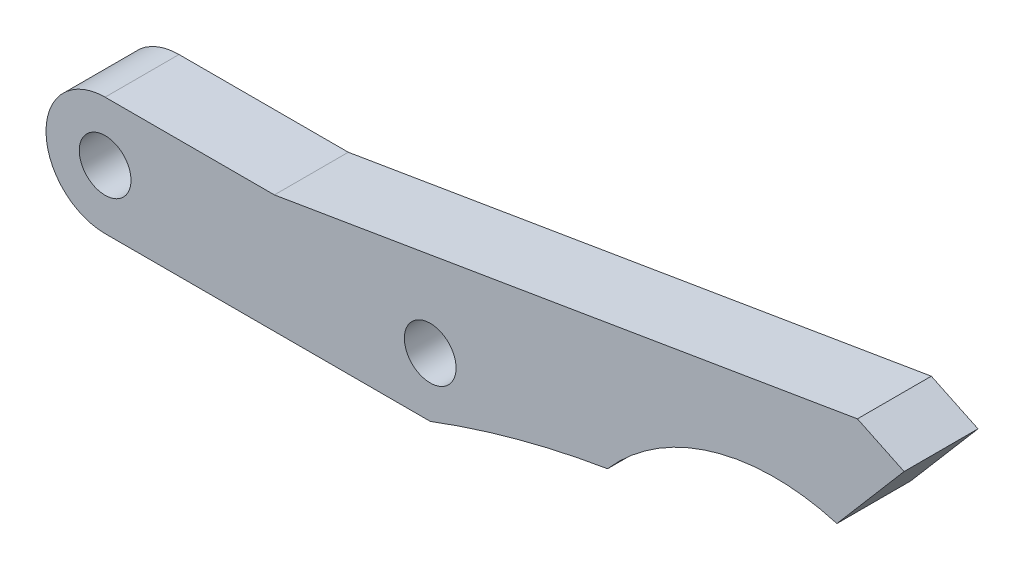
ISO-10303-21;
HEADER;
FILE_DESCRIPTION(('STEP AP214'),'2;1');
FILE_NAME('part.step','',(''),(''),'','','');
FILE_SCHEMA(('AUTOMOTIVE_DESIGN { 1 0 10303 214 1 1 1 1 }'));
ENDSEC;
DATA;
#1=APPLICATION_CONTEXT('core data for automotive mechanical design processes');
#2=APPLICATION_PROTOCOL_DEFINITION('international standard','automotive_design',2000,#1);
#3=PRODUCT_CONTEXT('',#1,'mechanical');
#4=PRODUCT('Part','Part','',(#3));
#5=PRODUCT_RELATED_PRODUCT_CATEGORY('part','',(#4));
#6=PRODUCT_DEFINITION_FORMATION('','',#4);
#7=PRODUCT_DEFINITION_CONTEXT('part definition',#1,'design');
#8=PRODUCT_DEFINITION('design','',#6,#7);
#9=PRODUCT_DEFINITION_SHAPE('','',#8);
#10=(LENGTH_UNIT() NAMED_UNIT(*) SI_UNIT(.MILLI.,.METRE.));
#11=(NAMED_UNIT(*) PLANE_ANGLE_UNIT() SI_UNIT($,.RADIAN.));
#12=(NAMED_UNIT(*) SI_UNIT($,.STERADIAN.) SOLID_ANGLE_UNIT());
#13=UNCERTAINTY_MEASURE_WITH_UNIT(LENGTH_MEASURE(1.E-05),#10,'distance_accuracy_value','');
#14=(GEOMETRIC_REPRESENTATION_CONTEXT(3) GLOBAL_UNCERTAINTY_ASSIGNED_CONTEXT((#13)) GLOBAL_UNIT_ASSIGNED_CONTEXT((#10,
#11,#12)) REPRESENTATION_CONTEXT('',''));
#15=CARTESIAN_POINT('',(0.,0.,0.));
#16=DIRECTION('',(0.,0.,1.));
#17=DIRECTION('',(1.,0.,0.));
#18=AXIS2_PLACEMENT_3D('',#15,#16,#17);
#19=CARTESIAN_POINT('',(0.,0.,-5.));
#20=DIRECTION('',(0.,0.,1.));
#21=DIRECTION('',(1.,0.,0.));
#22=AXIS2_PLACEMENT_3D('',#19,#20,#21);
#23=CYLINDRICAL_SURFACE('',#22,4.);
#24=CARTESIAN_POINT('',(0.,0.,0.));
#25=DIRECTION('',(0.,0.,1.));
#26=DIRECTION('',(1.,0.,0.));
#27=AXIS2_PLACEMENT_3D('',#24,#25,#26);
#28=CIRCLE('',#27,4.);
#29=CARTESIAN_POINT('',(0.,4.,0.));
#30=VERTEX_POINT('',#29);
#31=CARTESIAN_POINT('',(0.,-4.,0.));
#32=VERTEX_POINT('',#31);
#33=EDGE_CURVE('E136',#30,#32,#28,.T.);
#34=ORIENTED_EDGE('',*,*,#33,.F.);
#35=DIRECTION('',(0.,0.,1.));
#36=VECTOR('',#35,1.);
#37=CARTESIAN_POINT('',(0.,4.,-5.));
#38=LINE('',#37,#36);
#39=CARTESIAN_POINT('',(0.,4.,-5.));
#40=VERTEX_POINT('',#39);
#41=EDGE_CURVE('E11',#40,#30,#38,.T.);
#42=ORIENTED_EDGE('',*,*,#41,.F.);
#43=CARTESIAN_POINT('',(0.,0.,-5.));
#44=DIRECTION('',(0.,0.,1.));
#45=DIRECTION('',(1.,0.,0.));
#46=AXIS2_PLACEMENT_3D('',#43,#44,#45);
#47=CIRCLE('',#46,4.);
#48=CARTESIAN_POINT('',(0.,-4.,-5.));
#49=VERTEX_POINT('',#48);
#50=EDGE_CURVE('E160',#40,#49,#47,.T.);
#51=ORIENTED_EDGE('',*,*,#50,.T.);
#52=DIRECTION('',(0.,0.,1.));
#53=VECTOR('',#52,1.);
#54=CARTESIAN_POINT('',(0.,-4.,-5.));
#55=LINE('',#54,#53);
#56=EDGE_CURVE('E45',#49,#32,#55,.T.);
#57=ORIENTED_EDGE('',*,*,#56,.T.);
#58=EDGE_LOOP('',(#34,#42,#51,#57));
#59=FACE_BOUND('',#58,.T.);
#60=ADVANCED_FACE('F39',(#59),#23,.T.);
#61=CARTESIAN_POINT('',(0.,4.,-5.));
#62=DIRECTION('',(0.,1.,0.));
#63=DIRECTION('',(0.,0.,1.));
#64=AXIS2_PLACEMENT_3D('',#61,#62,#63);
#65=PLANE('',#64);
#66=DIRECTION('',(-1.,0.,0.));
#67=VECTOR('',#66,1.);
#68=CARTESIAN_POINT('',(0.,4.,0.));
#69=LINE('',#68,#67);
#70=CARTESIAN_POINT('',(11.4552917149461,4.,0.));
#71=VERTEX_POINT('',#70);
#72=EDGE_CURVE('E155',#71,#30,#69,.T.);
#73=ORIENTED_EDGE('',*,*,#72,.F.);
#74=DIRECTION('',(0.,0.,1.));
#75=VECTOR('',#74,1.);
#76=CARTESIAN_POINT('',(11.4552917149461,4.,-5.));
#77=LINE('',#76,#75);
#78=CARTESIAN_POINT('',(11.4552917149461,4.,-5.));
#79=VERTEX_POINT('',#78);
#80=EDGE_CURVE('E48',#79,#71,#77,.T.);
#81=ORIENTED_EDGE('',*,*,#80,.F.);
#82=DIRECTION('',(-1.,0.,0.));
#83=VECTOR('',#82,1.);
#84=CARTESIAN_POINT('',(0.,4.,-5.));
#85=LINE('',#84,#83);
#86=EDGE_CURVE('E128',#79,#40,#85,.T.);
#87=ORIENTED_EDGE('',*,*,#86,.T.);
#88=ORIENTED_EDGE('',*,*,#41,.T.);
#89=EDGE_LOOP('',(#73,#81,#87,#88));
#90=FACE_BOUND('',#89,.T.);
#91=ADVANCED_FACE('F170',(#90),#65,.T.);
#92=CARTESIAN_POINT('',(11.4552917149461,4.,-5.));
#93=DIRECTION('',(-0.165047605860678,0.986285601537231,0.));
#94=DIRECTION('',(-0.986285601537231,-0.165047605860678,0.));
#95=AXIS2_PLACEMENT_3D('',#92,#93,#94);
#96=PLANE('',#95);
#97=DIRECTION('',(-0.986285601537231,-0.165047605860678,0.));
#98=VECTOR('',#97,1.);
#99=CARTESIAN_POINT('',(11.4552917149461,4.,0.));
#100=LINE('',#99,#98);
#101=CARTESIAN_POINT('',(50.9067157764353,10.6019042344271,0.));
#102=VERTEX_POINT('',#101);
#103=EDGE_CURVE('E111',#102,#71,#100,.T.);
#104=ORIENTED_EDGE('',*,*,#103,.F.);
#105=DIRECTION('',(0.,0.,1.));
#106=VECTOR('',#105,1.);
#107=CARTESIAN_POINT('',(50.9067157764353,10.6019042344271,-5.));
#108=LINE('',#107,#106);
#109=CARTESIAN_POINT('',(50.9067157764353,10.6019042344271,-5.));
#110=VERTEX_POINT('',#109);
#111=EDGE_CURVE('E109',#110,#102,#108,.T.);
#112=ORIENTED_EDGE('',*,*,#111,.F.);
#113=DIRECTION('',(-0.986285601537231,-0.165047605860678,0.));
#114=VECTOR('',#113,1.);
#115=CARTESIAN_POINT('',(11.4552917149461,4.,-5.));
#116=LINE('',#115,#114);
#117=EDGE_CURVE('E112',#110,#79,#116,.T.);
#118=ORIENTED_EDGE('',*,*,#117,.T.);
#119=ORIENTED_EDGE('',*,*,#80,.T.);
#120=EDGE_LOOP('',(#104,#112,#118,#119));
#121=FACE_BOUND('',#120,.T.);
#122=ADVANCED_FACE('F110',(#121),#96,.T.);
#123=CARTESIAN_POINT('',(50.9067157764353,10.6019042344271,-5.));
#124=DIRECTION('',(0.430511096808295,0.902585284349861,0.));
#125=DIRECTION('',(-0.902585284349861,0.430511096808295,0.));
#126=AXIS2_PLACEMENT_3D('',#123,#124,#125);
#127=PLANE('',#126);
#128=DIRECTION('',(-0.902585284349861,0.430511096808295,0.));
#129=VECTOR('',#128,1.);
#130=CARTESIAN_POINT('',(50.9067157764353,10.6019042344271,0.));
#131=LINE('',#130,#129);
#132=CARTESIAN_POINT('',(54.0657642716599,9.0951153955981,0.));
#133=VERTEX_POINT('',#132);
#134=EDGE_CURVE('E152',#133,#102,#131,.T.);
#135=ORIENTED_EDGE('',*,*,#134,.F.);
#136=DIRECTION('',(0.,0.,1.));
#137=VECTOR('',#136,1.);
#138=CARTESIAN_POINT('',(54.0657642716599,9.0951153955981,-5.));
#139=LINE('',#138,#137);
#140=CARTESIAN_POINT('',(54.0657642716599,9.0951153955981,-5.));
#141=VERTEX_POINT('',#140);
#142=EDGE_CURVE('E119',#141,#133,#139,.T.);
#143=ORIENTED_EDGE('',*,*,#142,.F.);
#144=DIRECTION('',(-0.902585284349861,0.430511096808295,0.));
#145=VECTOR('',#144,1.);
#146=CARTESIAN_POINT('',(50.9067157764353,10.6019042344271,-5.));
#147=LINE('',#146,#145);
#148=EDGE_CURVE('E125',#141,#110,#147,.T.);
#149=ORIENTED_EDGE('',*,*,#148,.T.);
#150=ORIENTED_EDGE('',*,*,#111,.T.);
#151=EDGE_LOOP('',(#135,#143,#149,#150));
#152=FACE_BOUND('',#151,.T.);
#153=ADVANCED_FACE('F126',(#152),#127,.T.);
#154=CARTESIAN_POINT('',(54.0657642716599,9.0951153955981,-5.));
#155=DIRECTION('',(0.760405965600029,-0.649448048330186,0.));
#156=DIRECTION('',(0.649448048330186,0.760405965600029,0.));
#157=AXIS2_PLACEMENT_3D('',#154,#155,#156);
#158=PLANE('',#157);
#159=DIRECTION('',(0.649448048330186,0.760405965600029,0.));
#160=VECTOR('',#159,1.);
#161=CARTESIAN_POINT('',(54.0657642716599,9.0951153955981,0.));
#162=LINE('',#161,#160);
#163=CARTESIAN_POINT('',(49.5196279333486,3.7722736363979,0.));
#164=VERTEX_POINT('',#163);
#165=EDGE_CURVE('E146',#164,#133,#162,.T.);
#166=ORIENTED_EDGE('',*,*,#165,.F.);
#167=DIRECTION('',(0.,0.,1.));
#168=VECTOR('',#167,1.);
#169=CARTESIAN_POINT('',(49.5196279333486,3.7722736363979,-5.));
#170=LINE('',#169,#168);
#171=CARTESIAN_POINT('',(49.5196279333486,3.7722736363979,-5.));
#172=VERTEX_POINT('',#171);
#173=EDGE_CURVE('E161',#172,#164,#170,.T.);
#174=ORIENTED_EDGE('',*,*,#173,.F.);
#175=DIRECTION('',(0.649448048330186,0.760405965600029,0.));
#176=VECTOR('',#175,1.);
#177=CARTESIAN_POINT('',(54.0657642716599,9.0951153955981,-5.));
#178=LINE('',#177,#176);
#179=EDGE_CURVE('E129',#172,#141,#178,.T.);
#180=ORIENTED_EDGE('',*,*,#179,.T.);
#181=ORIENTED_EDGE('',*,*,#142,.T.);
#182=EDGE_LOOP('',(#166,#174,#180,#181));
#183=FACE_BOUND('',#182,.T.);
#184=ADVANCED_FACE('F185',(#183),#158,.T.);
#185=CARTESIAN_POINT('',(45.3133012258395,-10.6258795656519,-5.));
#186=DIRECTION('',(0.,0.,1.));
#187=DIRECTION('',(1.,0.,0.));
#188=AXIS2_PLACEMENT_3D('',#185,#186,#187);
#189=CYLINDRICAL_SURFACE('',#188,15.);
#190=CARTESIAN_POINT('',(45.3133012258395,-10.6258795656519,0.));
#191=DIRECTION('',(0.,0.,-1.));
#192=DIRECTION('',(-1.,0.,0.));
#193=AXIS2_PLACEMENT_3D('',#190,#191,#192);
#194=CIRCLE('',#193,15.);
#195=CARTESIAN_POINT('',(34.,-0.77655393526388,0.));
#196=VERTEX_POINT('',#195);
#197=EDGE_CURVE('E147',#196,#164,#194,.T.);
#198=ORIENTED_EDGE('',*,*,#197,.F.);
#199=DIRECTION('',(0.,0.,1.));
#200=VECTOR('',#199,1.);
#201=CARTESIAN_POINT('',(34.,-0.77655393526388,-5.));
#202=LINE('',#201,#200);
#203=CARTESIAN_POINT('',(34.,-0.77655393526388,-5.));
#204=VERTEX_POINT('',#203);
#205=EDGE_CURVE('E164',#204,#196,#202,.T.);
#206=ORIENTED_EDGE('',*,*,#205,.F.);
#207=CARTESIAN_POINT('',(45.3133012258395,-10.6258795656519,-5.));
#208=DIRECTION('',(0.,0.,-1.));
#209=DIRECTION('',(-1.,0.,0.));
#210=AXIS2_PLACEMENT_3D('',#207,#208,#209);
#211=CIRCLE('',#210,15.);
#212=EDGE_CURVE('E131',#204,#172,#211,.T.);
#213=ORIENTED_EDGE('',*,*,#212,.T.);
#214=ORIENTED_EDGE('',*,*,#173,.T.);
#215=EDGE_LOOP('',(#198,#206,#213,#214));
#216=FACE_BOUND('',#215,.T.);
#217=ADVANCED_FACE('F184',(#216),#189,.F.);
#218=CARTESIAN_POINT('',(44.5247163012657,-63.9052347925246,-5.));
#219=DIRECTION('',(0.,0.,1.));
#220=DIRECTION('',(1.,0.,0.));
#221=AXIS2_PLACEMENT_3D('',#218,#219,#220);
#222=CYLINDRICAL_SURFACE('',#221,64.);
#223=CARTESIAN_POINT('',(44.5247163012657,-63.9052347925246,0.));
#224=DIRECTION('',(0.,0.,-1.));
#225=DIRECTION('',(-1.,0.,0.));
#226=AXIS2_PLACEMENT_3D('',#223,#224,#225);
#227=CIRCLE('',#226,64.);
#228=CARTESIAN_POINT('',(22.,-4.00000000000001,0.));
#229=VERTEX_POINT('',#228);
#230=EDGE_CURVE('E142',#229,#196,#227,.T.);
#231=ORIENTED_EDGE('',*,*,#230,.F.);
#232=DIRECTION('',(0.,0.,1.));
#233=VECTOR('',#232,1.);
#234=CARTESIAN_POINT('',(22.,-4.00000000000001,-5.));
#235=LINE('',#234,#233);
#236=CARTESIAN_POINT('',(22.,-4.00000000000001,-5.));
#237=VERTEX_POINT('',#236);
#238=EDGE_CURVE('E163',#237,#229,#235,.T.);
#239=ORIENTED_EDGE('',*,*,#238,.F.);
#240=CARTESIAN_POINT('',(44.5247163012657,-63.9052347925246,-5.));
#241=DIRECTION('',(0.,0.,-1.));
#242=DIRECTION('',(-1.,0.,0.));
#243=AXIS2_PLACEMENT_3D('',#240,#241,#242);
#244=CIRCLE('',#243,64.);
#245=EDGE_CURVE('E231',#237,#204,#244,.T.);
#246=ORIENTED_EDGE('',*,*,#245,.T.);
#247=ORIENTED_EDGE('',*,*,#205,.T.);
#248=EDGE_LOOP('',(#231,#239,#246,#247));
#249=FACE_BOUND('',#248,.T.);
#250=ADVANCED_FACE('F188',(#249),#222,.F.);
#251=CARTESIAN_POINT('',(22.,-4.,-5.));
#252=DIRECTION('',(0.,-1.,0.));
#253=DIRECTION('',(1.,0.,0.));
#254=AXIS2_PLACEMENT_3D('',#251,#252,#253);
#255=PLANE('',#254);
#256=DIRECTION('',(1.,0.,0.));
#257=VECTOR('',#256,1.);
#258=CARTESIAN_POINT('',(22.,-4.,0.));
#259=LINE('',#258,#257);
#260=EDGE_CURVE('E137',#32,#229,#259,.T.);
#261=ORIENTED_EDGE('',*,*,#260,.F.);
#262=ORIENTED_EDGE('',*,*,#56,.F.);
#263=DIRECTION('',(1.,0.,0.));
#264=VECTOR('',#263,1.);
#265=CARTESIAN_POINT('',(22.,-4.,-5.));
#266=LINE('',#265,#264);
#267=EDGE_CURVE('E227',#49,#237,#266,.T.);
#268=ORIENTED_EDGE('',*,*,#267,.T.);
#269=ORIENTED_EDGE('',*,*,#238,.T.);
#270=EDGE_LOOP('',(#261,#262,#268,#269));
#271=FACE_BOUND('',#270,.T.);
#272=ADVANCED_FACE('F168',(#271),#255,.T.);
#273=CARTESIAN_POINT('',(0.,0.,-5.));
#274=DIRECTION('',(0.,0.,1.));
#275=DIRECTION('',(1.,0.,0.));
#276=AXIS2_PLACEMENT_3D('',#273,#274,#275);
#277=PLANE('',#276);
#278=CARTESIAN_POINT('',(22.,0.,-5.));
#279=DIRECTION('',(0.,0.,1.));
#280=DIRECTION('',(1.,0.,0.));
#281=AXIS2_PLACEMENT_3D('',#278,#279,#280);
#282=CIRCLE('',#281,1.75);
#283=CARTESIAN_POINT('',(23.75,0.,-5.));
#284=VERTEX_POINT('',#283);
#285=EDGE_CURVE('E218',#284,#284,#282,.T.);
#286=ORIENTED_EDGE('',*,*,#285,.T.);
#287=EDGE_LOOP('',(#286));
#288=FACE_BOUND('',#287,.T.);
#289=CARTESIAN_POINT('',(0.,0.,-5.));
#290=DIRECTION('',(0.,0.,1.));
#291=DIRECTION('',(1.,0.,0.));
#292=AXIS2_PLACEMENT_3D('',#289,#290,#291);
#293=CIRCLE('',#292,1.75);
#294=CARTESIAN_POINT('',(1.75,0.,-5.));
#295=VERTEX_POINT('',#294);
#296=EDGE_CURVE('E139',#295,#295,#293,.T.);
#297=ORIENTED_EDGE('',*,*,#296,.T.);
#298=EDGE_LOOP('',(#297));
#299=FACE_BOUND('',#298,.T.);
#300=ORIENTED_EDGE('',*,*,#50,.F.);
#301=ORIENTED_EDGE('',*,*,#86,.F.);
#302=ORIENTED_EDGE('',*,*,#117,.F.);
#303=ORIENTED_EDGE('',*,*,#148,.F.);
#304=ORIENTED_EDGE('',*,*,#179,.F.);
#305=ORIENTED_EDGE('',*,*,#212,.F.);
#306=ORIENTED_EDGE('',*,*,#245,.F.);
#307=ORIENTED_EDGE('',*,*,#267,.F.);
#308=EDGE_LOOP('',(#300,#301,#302,#303,#304,#305,#306,#307));
#309=FACE_BOUND('',#308,.T.);
#310=ADVANCED_FACE('F122',(#288,#299,#309),#277,.F.);
#311=CARTESIAN_POINT('',(0.,0.,0.));
#312=DIRECTION('',(0.,0.,1.));
#313=DIRECTION('',(1.,0.,0.));
#314=AXIS2_PLACEMENT_3D('',#311,#312,#313);
#315=PLANE('',#314);
#316=CARTESIAN_POINT('',(22.,0.,0.));
#317=DIRECTION('',(0.,0.,1.));
#318=DIRECTION('',(1.,0.,0.));
#319=AXIS2_PLACEMENT_3D('',#316,#317,#318);
#320=CIRCLE('',#319,1.75);
#321=CARTESIAN_POINT('',(23.75,0.,0.));
#322=VERTEX_POINT('',#321);
#323=EDGE_CURVE('E219',#322,#322,#320,.T.);
#324=ORIENTED_EDGE('',*,*,#323,.F.);
#325=EDGE_LOOP('',(#324));
#326=FACE_BOUND('',#325,.T.);
#327=CARTESIAN_POINT('',(0.,0.,0.));
#328=DIRECTION('',(0.,0.,1.));
#329=DIRECTION('',(1.,0.,0.));
#330=AXIS2_PLACEMENT_3D('',#327,#328,#329);
#331=CIRCLE('',#330,1.75);
#332=CARTESIAN_POINT('',(1.75,0.,0.));
#333=VERTEX_POINT('',#332);
#334=EDGE_CURVE('E221',#333,#333,#331,.T.);
#335=ORIENTED_EDGE('',*,*,#334,.F.);
#336=EDGE_LOOP('',(#335));
#337=FACE_BOUND('',#336,.T.);
#338=ORIENTED_EDGE('',*,*,#33,.T.);
#339=ORIENTED_EDGE('',*,*,#260,.T.);
#340=ORIENTED_EDGE('',*,*,#230,.T.);
#341=ORIENTED_EDGE('',*,*,#197,.T.);
#342=ORIENTED_EDGE('',*,*,#165,.T.);
#343=ORIENTED_EDGE('',*,*,#134,.T.);
#344=ORIENTED_EDGE('',*,*,#103,.T.);
#345=ORIENTED_EDGE('',*,*,#72,.T.);
#346=EDGE_LOOP('',(#338,#339,#340,#341,#342,#343,#344,#345));
#347=FACE_BOUND('',#346,.T.);
#348=ADVANCED_FACE('F166',(#326,#337,#347),#315,.T.);
#349=CARTESIAN_POINT('',(0.,0.,-5.));
#350=DIRECTION('',(0.,0.,1.));
#351=DIRECTION('',(1.,0.,0.));
#352=AXIS2_PLACEMENT_3D('',#349,#350,#351);
#353=CYLINDRICAL_SURFACE('',#352,1.75);
#354=ORIENTED_EDGE('',*,*,#296,.F.);
#355=EDGE_LOOP('',(#354));
#356=FACE_BOUND('',#355,.T.);
#357=ORIENTED_EDGE('',*,*,#334,.T.);
#358=EDGE_LOOP('',(#357));
#359=FACE_BOUND('',#358,.T.);
#360=ADVANCED_FACE('F202',(#356,#359),#353,.F.);
#361=CARTESIAN_POINT('',(22.,0.,-5.));
#362=DIRECTION('',(0.,0.,1.));
#363=DIRECTION('',(1.,0.,0.));
#364=AXIS2_PLACEMENT_3D('',#361,#362,#363);
#365=CYLINDRICAL_SURFACE('',#364,1.75);
#366=ORIENTED_EDGE('',*,*,#285,.F.);
#367=EDGE_LOOP('',(#366));
#368=FACE_BOUND('',#367,.T.);
#369=ORIENTED_EDGE('',*,*,#323,.T.);
#370=EDGE_LOOP('',(#369));
#371=FACE_BOUND('',#370,.T.);
#372=ADVANCED_FACE('F209',(#368,#371),#365,.F.);
#373=CLOSED_SHELL('',(#60,#91,#122,#153,#184,#217,#250,#272,#310,#348,#360,#372));
#374=MANIFOLD_SOLID_BREP('B2',#373);
#375=ADVANCED_BREP_SHAPE_REPRESENTATION('',(#18,#374),#14);
#376=SHAPE_DEFINITION_REPRESENTATION(#9,#375);
ENDSEC;
END-ISO-10303-21;
